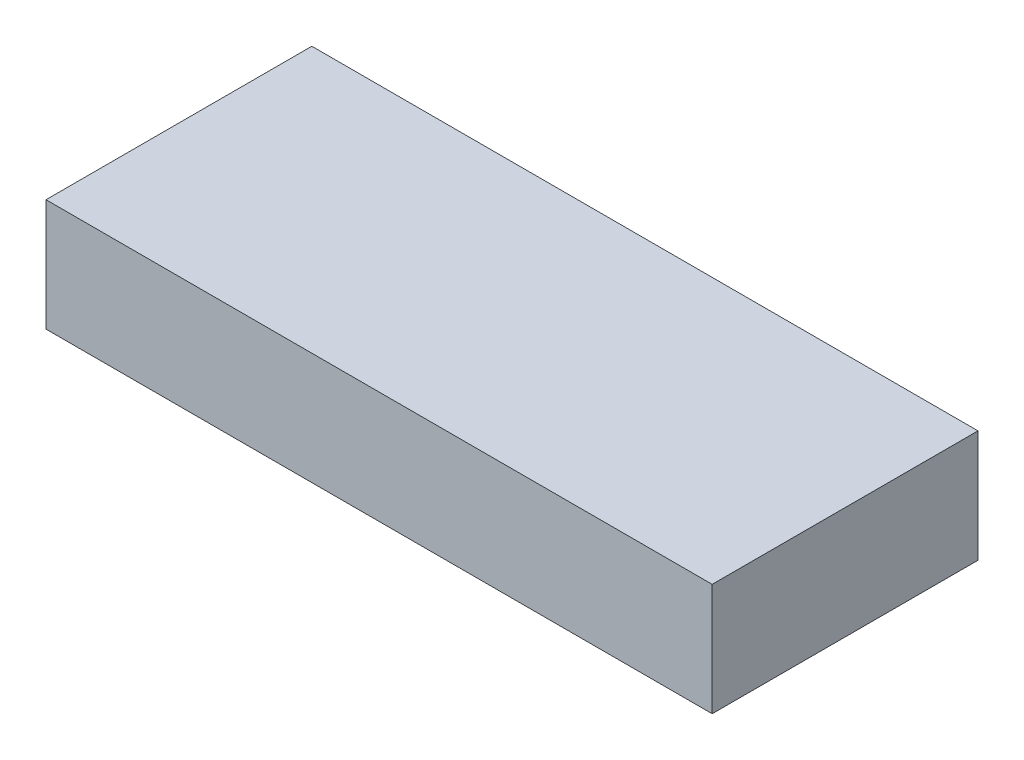
ISO-10303-21;
HEADER;
FILE_DESCRIPTION(('STEP AP214'),'2;1');
FILE_NAME('part.step','',(''),(''),'','','');
FILE_SCHEMA(('AUTOMOTIVE_DESIGN { 1 0 10303 214 1 1 1 1 }'));
ENDSEC;
DATA;
#1=APPLICATION_CONTEXT('core data for automotive mechanical design processes');
#2=APPLICATION_PROTOCOL_DEFINITION('international standard','automotive_design',2000,#1);
#3=PRODUCT_CONTEXT('',#1,'mechanical');
#4=PRODUCT('Part','Part','',(#3));
#5=PRODUCT_RELATED_PRODUCT_CATEGORY('part','',(#4));
#6=PRODUCT_DEFINITION_FORMATION('','',#4);
#7=PRODUCT_DEFINITION_CONTEXT('part definition',#1,'design');
#8=PRODUCT_DEFINITION('design','',#6,#7);
#9=PRODUCT_DEFINITION_SHAPE('','',#8);
#10=(LENGTH_UNIT() NAMED_UNIT(*) SI_UNIT(.MILLI.,.METRE.));
#11=(NAMED_UNIT(*) PLANE_ANGLE_UNIT() SI_UNIT($,.RADIAN.));
#12=(NAMED_UNIT(*) SI_UNIT($,.STERADIAN.) SOLID_ANGLE_UNIT());
#13=UNCERTAINTY_MEASURE_WITH_UNIT(LENGTH_MEASURE(1.E-05),#10,'distance_accuracy_value','');
#14=(GEOMETRIC_REPRESENTATION_CONTEXT(3) GLOBAL_UNCERTAINTY_ASSIGNED_CONTEXT((#13)) GLOBAL_UNIT_ASSIGNED_CONTEXT((#10,
#11,#12)) REPRESENTATION_CONTEXT('',''));
#15=CARTESIAN_POINT('',(0.,0.,0.));
#16=DIRECTION('',(0.,0.,1.));
#17=DIRECTION('',(1.,0.,0.));
#18=AXIS2_PLACEMENT_3D('',#15,#16,#17);
#19=CARTESIAN_POINT('',(0.,7.,0.));
#20=DIRECTION('',(1.,0.,0.));
#21=DIRECTION('',(0.,0.,-1.));
#22=AXIS2_PLACEMENT_3D('',#19,#20,#21);
#23=PLANE('',#22);
#24=DIRECTION('',(0.,0.,1.));
#25=VECTOR('',#24,1.);
#26=CARTESIAN_POINT('',(0.,0.,0.));
#27=LINE('',#26,#25);
#28=CARTESIAN_POINT('',(0.,0.,-16.6));
#29=VERTEX_POINT('',#28);
#30=CARTESIAN_POINT('',(0.,0.,0.));
#31=VERTEX_POINT('',#30);
#32=EDGE_CURVE('E107',#29,#31,#27,.T.);
#33=ORIENTED_EDGE('',*,*,#32,.T.);
#34=DIRECTION('',(0.,-1.,0.));
#35=VECTOR('',#34,1.);
#36=CARTESIAN_POINT('',(0.,7.,0.));
#37=LINE('',#36,#35);
#38=CARTESIAN_POINT('',(0.,7.,0.));
#39=VERTEX_POINT('',#38);
#40=EDGE_CURVE('E11',#39,#31,#37,.T.);
#41=ORIENTED_EDGE('',*,*,#40,.F.);
#42=DIRECTION('',(0.,0.,1.));
#43=VECTOR('',#42,1.);
#44=CARTESIAN_POINT('',(0.,7.,0.));
#45=LINE('',#44,#43);
#46=CARTESIAN_POINT('',(0.,7.,-16.6));
#47=VERTEX_POINT('',#46);
#48=EDGE_CURVE('E91',#47,#39,#45,.T.);
#49=ORIENTED_EDGE('',*,*,#48,.F.);
#50=DIRECTION('',(0.,-1.,0.));
#51=VECTOR('',#50,1.);
#52=CARTESIAN_POINT('',(0.,7.,-16.6));
#53=LINE('',#52,#51);
#54=EDGE_CURVE('E103',#47,#29,#53,.T.);
#55=ORIENTED_EDGE('',*,*,#54,.T.);
#56=EDGE_LOOP('',(#33,#41,#49,#55));
#57=FACE_BOUND('',#56,.T.);
#58=ADVANCED_FACE('F39',(#57),#23,.F.);
#59=CARTESIAN_POINT('',(0.,7.,0.));
#60=DIRECTION('',(0.,0.,-1.));
#61=DIRECTION('',(-1.,0.,0.));
#62=AXIS2_PLACEMENT_3D('',#59,#60,#61);
#63=PLANE('',#62);
#64=DIRECTION('',(1.,0.,0.));
#65=VECTOR('',#64,1.);
#66=CARTESIAN_POINT('',(0.,0.,0.));
#67=LINE('',#66,#65);
#68=CARTESIAN_POINT('',(41.6,0.,0.));
#69=VERTEX_POINT('',#68);
#70=EDGE_CURVE('E96',#31,#69,#67,.T.);
#71=ORIENTED_EDGE('',*,*,#70,.T.);
#72=DIRECTION('',(0.,-1.,0.));
#73=VECTOR('',#72,1.);
#74=CARTESIAN_POINT('',(41.6,7.,0.));
#75=LINE('',#74,#73);
#76=CARTESIAN_POINT('',(41.6,7.,0.));
#77=VERTEX_POINT('',#76);
#78=EDGE_CURVE('E48',#77,#69,#75,.T.);
#79=ORIENTED_EDGE('',*,*,#78,.F.);
#80=DIRECTION('',(1.,0.,0.));
#81=VECTOR('',#80,1.);
#82=CARTESIAN_POINT('',(0.,7.,0.));
#83=LINE('',#82,#81);
#84=EDGE_CURVE('E86',#39,#77,#83,.T.);
#85=ORIENTED_EDGE('',*,*,#84,.F.);
#86=ORIENTED_EDGE('',*,*,#40,.T.);
#87=EDGE_LOOP('',(#71,#79,#85,#86));
#88=FACE_BOUND('',#87,.T.);
#89=ADVANCED_FACE('F95',(#88),#63,.F.);
#90=CARTESIAN_POINT('',(41.6,7.,0.));
#91=DIRECTION('',(-1.,0.,0.));
#92=DIRECTION('',(0.,0.,1.));
#93=AXIS2_PLACEMENT_3D('',#90,#91,#92);
#94=PLANE('',#93);
#95=DIRECTION('',(0.,0.,-1.));
#96=VECTOR('',#95,1.);
#97=CARTESIAN_POINT('',(41.6,0.,0.));
#98=LINE('',#97,#96);
#99=CARTESIAN_POINT('',(41.6,0.,-16.6));
#100=VERTEX_POINT('',#99);
#101=EDGE_CURVE('E73',#69,#100,#98,.T.);
#102=ORIENTED_EDGE('',*,*,#101,.T.);
#103=DIRECTION('',(0.,-1.,0.));
#104=VECTOR('',#103,1.);
#105=CARTESIAN_POINT('',(41.6,7.,-16.6));
#106=LINE('',#105,#104);
#107=CARTESIAN_POINT('',(41.6,7.,-16.6));
#108=VERTEX_POINT('',#107);
#109=EDGE_CURVE('E98',#108,#100,#106,.T.);
#110=ORIENTED_EDGE('',*,*,#109,.F.);
#111=DIRECTION('',(0.,0.,-1.));
#112=VECTOR('',#111,1.);
#113=CARTESIAN_POINT('',(41.6,7.,0.));
#114=LINE('',#113,#112);
#115=EDGE_CURVE('E89',#77,#108,#114,.T.);
#116=ORIENTED_EDGE('',*,*,#115,.F.);
#117=ORIENTED_EDGE('',*,*,#78,.T.);
#118=EDGE_LOOP('',(#102,#110,#116,#117));
#119=FACE_BOUND('',#118,.T.);
#120=ADVANCED_FACE('F99',(#119),#94,.F.);
#121=CARTESIAN_POINT('',(0.,7.,-16.6));
#122=DIRECTION('',(0.,0.,1.));
#123=DIRECTION('',(1.,0.,0.));
#124=AXIS2_PLACEMENT_3D('',#121,#122,#123);
#125=PLANE('',#124);
#126=DIRECTION('',(-1.,0.,0.));
#127=VECTOR('',#126,1.);
#128=CARTESIAN_POINT('',(0.,0.,-16.6));
#129=LINE('',#128,#127);
#130=EDGE_CURVE('E79',#100,#29,#129,.T.);
#131=ORIENTED_EDGE('',*,*,#130,.T.);
#132=ORIENTED_EDGE('',*,*,#54,.F.);
#133=DIRECTION('',(-1.,0.,0.));
#134=VECTOR('',#133,1.);
#135=CARTESIAN_POINT('',(0.,7.,-16.6));
#136=LINE('',#135,#134);
#137=EDGE_CURVE('E56',#108,#47,#136,.T.);
#138=ORIENTED_EDGE('',*,*,#137,.F.);
#139=ORIENTED_EDGE('',*,*,#109,.T.);
#140=EDGE_LOOP('',(#131,#132,#138,#139));
#141=FACE_BOUND('',#140,.T.);
#142=ADVANCED_FACE('F120',(#141),#125,.F.);
#143=CARTESIAN_POINT('',(0.,7.,0.));
#144=DIRECTION('',(0.,-1.,0.));
#145=DIRECTION('',(0.,0.,-1.));
#146=AXIS2_PLACEMENT_3D('',#143,#144,#145);
#147=PLANE('',#146);
#148=ORIENTED_EDGE('',*,*,#48,.T.);
#149=ORIENTED_EDGE('',*,*,#84,.T.);
#150=ORIENTED_EDGE('',*,*,#115,.T.);
#151=ORIENTED_EDGE('',*,*,#137,.T.);
#152=EDGE_LOOP('',(#148,#149,#150,#151));
#153=FACE_BOUND('',#152,.T.);
#154=ADVANCED_FACE('F87',(#153),#147,.F.);
#155=CARTESIAN_POINT('',(0.,0.,0.));
#156=DIRECTION('',(0.,-1.,0.));
#157=DIRECTION('',(0.,0.,-1.));
#158=AXIS2_PLACEMENT_3D('',#155,#156,#157);
#159=PLANE('',#158);
#160=ORIENTED_EDGE('',*,*,#32,.F.);
#161=ORIENTED_EDGE('',*,*,#130,.F.);
#162=ORIENTED_EDGE('',*,*,#101,.F.);
#163=ORIENTED_EDGE('',*,*,#70,.F.);
#164=EDGE_LOOP('',(#160,#161,#162,#163));
#165=FACE_BOUND('',#164,.T.);
#166=ADVANCED_FACE('F123',(#165),#159,.T.);
#167=CLOSED_SHELL('',(#58,#89,#120,#142,#154,#166));
#168=MANIFOLD_SOLID_BREP('B2',#167);
#169=ADVANCED_BREP_SHAPE_REPRESENTATION('',(#18,#168),#14);
#170=SHAPE_DEFINITION_REPRESENTATION(#9,#169);
ENDSEC;
END-ISO-10303-21;
